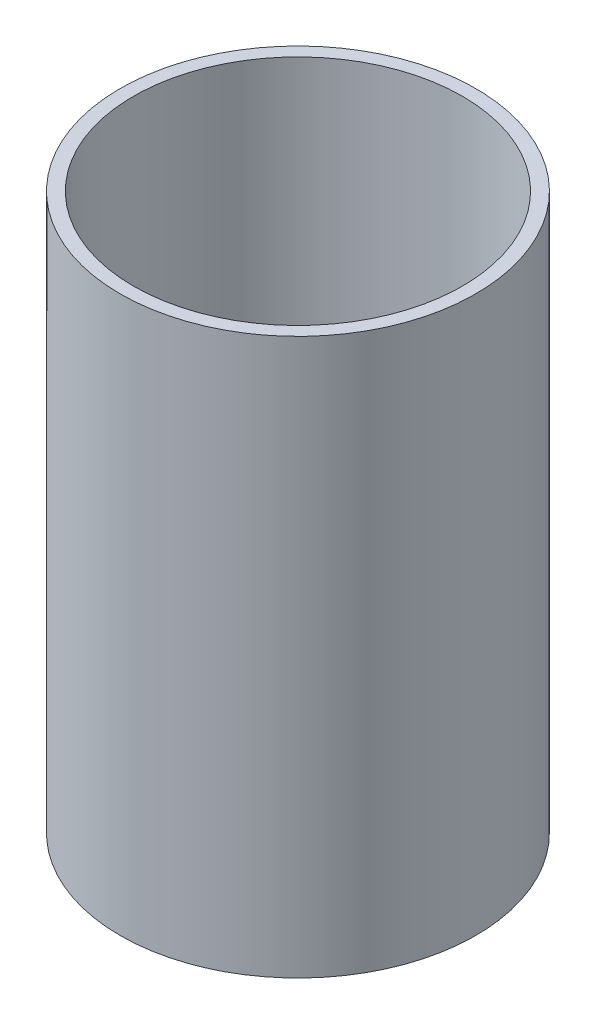
ISO-10303-21;
HEADER;
FILE_DESCRIPTION(('STEP AP214'),'2;1');
FILE_NAME('part.step','',(''),(''),'','','');
FILE_SCHEMA(('AUTOMOTIVE_DESIGN { 1 0 10303 214 1 1 1 1 }'));
ENDSEC;
DATA;
#1=APPLICATION_CONTEXT('core data for automotive mechanical design processes');
#2=APPLICATION_PROTOCOL_DEFINITION('international standard','automotive_design',2000,#1);
#3=PRODUCT_CONTEXT('',#1,'mechanical');
#4=PRODUCT('Part','Part','',(#3));
#5=PRODUCT_RELATED_PRODUCT_CATEGORY('part','',(#4));
#6=PRODUCT_DEFINITION_FORMATION('','',#4);
#7=PRODUCT_DEFINITION_CONTEXT('part definition',#1,'design');
#8=PRODUCT_DEFINITION('design','',#6,#7);
#9=PRODUCT_DEFINITION_SHAPE('','',#8);
#10=(LENGTH_UNIT() NAMED_UNIT(*) SI_UNIT(.MILLI.,.METRE.));
#11=(NAMED_UNIT(*) PLANE_ANGLE_UNIT() SI_UNIT($,.RADIAN.));
#12=(NAMED_UNIT(*) SI_UNIT($,.STERADIAN.) SOLID_ANGLE_UNIT());
#13=UNCERTAINTY_MEASURE_WITH_UNIT(LENGTH_MEASURE(1.E-05),#10,'distance_accuracy_value','');
#14=(GEOMETRIC_REPRESENTATION_CONTEXT(3) GLOBAL_UNCERTAINTY_ASSIGNED_CONTEXT((#13)) GLOBAL_UNIT_ASSIGNED_CONTEXT((#10,
#11,#12)) REPRESENTATION_CONTEXT('',''));
#15=CARTESIAN_POINT('',(0.,0.,0.));
#16=DIRECTION('',(0.,0.,1.));
#17=DIRECTION('',(1.,0.,0.));
#18=AXIS2_PLACEMENT_3D('',#15,#16,#17);
#19=CARTESIAN_POINT('',(0.,50.,0.));
#20=DIRECTION('',(0.,1.,0.));
#21=DIRECTION('',(0.,0.,1.));
#22=AXIS2_PLACEMENT_3D('',#19,#20,#21);
#23=PLANE('',#22);
#24=CARTESIAN_POINT('',(0.,50.,0.));
#25=DIRECTION('',(0.,1.,0.));
#26=DIRECTION('',(0.,0.,1.));
#27=AXIS2_PLACEMENT_3D('',#24,#25,#26);
#28=CIRCLE('',#27,16.);
#29=CARTESIAN_POINT('',(0.,50.,16.));
#30=VERTEX_POINT('',#29);
#31=EDGE_CURVE('E10',#30,#30,#28,.T.);
#32=ORIENTED_EDGE('',*,*,#31,.T.);
#33=EDGE_LOOP('',(#32));
#34=FACE_BOUND('',#33,.T.);
#35=CARTESIAN_POINT('',(0.,50.,0.));
#36=DIRECTION('',(0.,1.,0.));
#37=DIRECTION('',(0.,0.,1.));
#38=AXIS2_PLACEMENT_3D('',#35,#36,#37);
#39=CIRCLE('',#38,14.8);
#40=CARTESIAN_POINT('',(0.,50.,14.8));
#41=VERTEX_POINT('',#40);
#42=EDGE_CURVE('E43',#41,#41,#39,.T.);
#43=ORIENTED_EDGE('',*,*,#42,.F.);
#44=EDGE_LOOP('',(#43));
#45=FACE_BOUND('',#44,.T.);
#46=ADVANCED_FACE('F32',(#34,#45),#23,.T.);
#47=CARTESIAN_POINT('',(0.,0.,0.));
#48=DIRECTION('',(0.,1.,0.));
#49=DIRECTION('',(0.,0.,1.));
#50=AXIS2_PLACEMENT_3D('',#47,#48,#49);
#51=PLANE('',#50);
#52=CARTESIAN_POINT('',(0.,0.,0.));
#53=DIRECTION('',(0.,1.,0.));
#54=DIRECTION('',(0.,0.,1.));
#55=AXIS2_PLACEMENT_3D('',#52,#53,#54);
#56=CIRCLE('',#55,16.);
#57=CARTESIAN_POINT('',(0.,0.,16.));
#58=VERTEX_POINT('',#57);
#59=EDGE_CURVE('E36',#58,#58,#56,.T.);
#60=ORIENTED_EDGE('',*,*,#59,.F.);
#61=EDGE_LOOP('',(#60));
#62=FACE_BOUND('',#61,.T.);
#63=CARTESIAN_POINT('',(0.,0.,0.));
#64=DIRECTION('',(0.,1.,0.));
#65=DIRECTION('',(0.,0.,1.));
#66=AXIS2_PLACEMENT_3D('',#63,#64,#65);
#67=CIRCLE('',#66,14.8);
#68=CARTESIAN_POINT('',(0.,0.,14.8));
#69=VERTEX_POINT('',#68);
#70=EDGE_CURVE('E45',#69,#69,#67,.T.);
#71=ORIENTED_EDGE('',*,*,#70,.T.);
#72=EDGE_LOOP('',(#71));
#73=FACE_BOUND('',#72,.T.);
#74=ADVANCED_FACE('F55',(#62,#73),#51,.F.);
#75=CARTESIAN_POINT('',(0.,50.,0.));
#76=DIRECTION('',(0.,-1.,0.));
#77=DIRECTION('',(0.,0.,-1.));
#78=AXIS2_PLACEMENT_3D('',#75,#76,#77);
#79=CYLINDRICAL_SURFACE('',#78,16.);
#80=ORIENTED_EDGE('',*,*,#31,.F.);
#81=EDGE_LOOP('',(#80));
#82=FACE_BOUND('',#81,.T.);
#83=ORIENTED_EDGE('',*,*,#59,.T.);
#84=EDGE_LOOP('',(#83));
#85=FACE_BOUND('',#84,.T.);
#86=ADVANCED_FACE('F34',(#82,#85),#79,.T.);
#87=CARTESIAN_POINT('',(0.,50.,0.));
#88=DIRECTION('',(0.,-1.,0.));
#89=DIRECTION('',(0.,0.,-1.));
#90=AXIS2_PLACEMENT_3D('',#87,#88,#89);
#91=CYLINDRICAL_SURFACE('',#90,14.8);
#92=ORIENTED_EDGE('',*,*,#42,.T.);
#93=EDGE_LOOP('',(#92));
#94=FACE_BOUND('',#93,.T.);
#95=ORIENTED_EDGE('',*,*,#70,.F.);
#96=EDGE_LOOP('',(#95));
#97=FACE_BOUND('',#96,.T.);
#98=ADVANCED_FACE('F51',(#94,#97),#91,.F.);
#99=CLOSED_SHELL('',(#46,#74,#86,#98));
#100=MANIFOLD_SOLID_BREP('B2',#99);
#101=ADVANCED_BREP_SHAPE_REPRESENTATION('',(#18,#100),#14);
#102=SHAPE_DEFINITION_REPRESENTATION(#9,#101);
ENDSEC;
END-ISO-10303-21;
